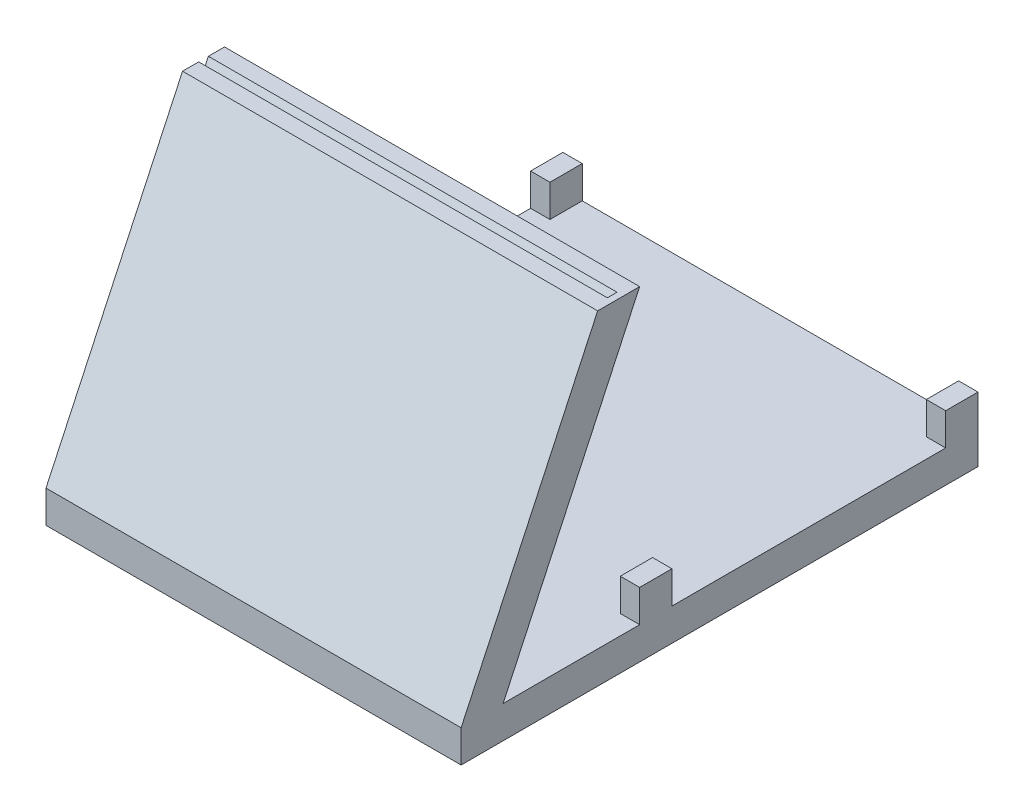
ISO-10303-21;
HEADER;
FILE_DESCRIPTION(('STEP AP214'),'2;1');
FILE_NAME('part.step','',(''),(''),'','','');
FILE_SCHEMA(('AUTOMOTIVE_DESIGN { 1 0 10303 214 1 1 1 1 }'));
ENDSEC;
DATA;
#1=APPLICATION_CONTEXT('core data for automotive mechanical design processes');
#2=APPLICATION_PROTOCOL_DEFINITION('international standard','automotive_design',2000,#1);
#3=PRODUCT_CONTEXT('',#1,'mechanical');
#4=PRODUCT('Part','Part','',(#3));
#5=PRODUCT_RELATED_PRODUCT_CATEGORY('part','',(#4));
#6=PRODUCT_DEFINITION_FORMATION('','',#4);
#7=PRODUCT_DEFINITION_CONTEXT('part definition',#1,'design');
#8=PRODUCT_DEFINITION('design','',#6,#7);
#9=PRODUCT_DEFINITION_SHAPE('','',#8);
#10=(LENGTH_UNIT() NAMED_UNIT(*) SI_UNIT(.MILLI.,.METRE.));
#11=(NAMED_UNIT(*) PLANE_ANGLE_UNIT() SI_UNIT($,.RADIAN.));
#12=(NAMED_UNIT(*) SI_UNIT($,.STERADIAN.) SOLID_ANGLE_UNIT());
#13=UNCERTAINTY_MEASURE_WITH_UNIT(LENGTH_MEASURE(1.E-05),#10,'distance_accuracy_value','');
#14=(GEOMETRIC_REPRESENTATION_CONTEXT(3) GLOBAL_UNCERTAINTY_ASSIGNED_CONTEXT((#13)) GLOBAL_UNIT_ASSIGNED_CONTEXT((#10,
#11,#12)) REPRESENTATION_CONTEXT('',''));
#15=CARTESIAN_POINT('',(0.,0.,0.));
#16=DIRECTION('',(0.,0.,1.));
#17=DIRECTION('',(1.,0.,0.));
#18=AXIS2_PLACEMENT_3D('',#15,#16,#17);
#19=CARTESIAN_POINT('',(0.,10.,0.));
#20=DIRECTION('',(0.,-1.,0.));
#21=DIRECTION('',(0.,0.,-1.));
#22=AXIS2_PLACEMENT_3D('',#19,#20,#21);
#23=PLANE('',#22);
#24=DIRECTION('',(-1.,0.,0.));
#25=VECTOR('',#24,1.);
#26=CARTESIAN_POINT('',(64.25,10.,14.7381738259296));
#27=LINE('',#26,#25);
#28=CARTESIAN_POINT('',(64.25,10.,14.7381738259296));
#29=VERTEX_POINT('',#28);
#30=CARTESIAN_POINT('',(58.25,10.,14.7381738259296));
#31=VERTEX_POINT('',#30);
#32=EDGE_CURVE('E511',#29,#31,#27,.T.);
#33=ORIENTED_EDGE('',*,*,#32,.F.);
#34=DIRECTION('',(0.,0.,-1.));
#35=VECTOR('',#34,1.);
#36=CARTESIAN_POINT('',(64.25,10.,80.));
#37=LINE('',#36,#35);
#38=CARTESIAN_POINT('',(64.25,10.,-70.));
#39=VERTEX_POINT('',#38);
#40=EDGE_CURVE('E230',#29,#39,#37,.T.);
#41=ORIENTED_EDGE('',*,*,#40,.T.);
#42=DIRECTION('',(1.,0.,0.));
#43=VECTOR('',#42,1.);
#44=CARTESIAN_POINT('',(64.25,10.,-70.));
#45=LINE('',#44,#43);
#46=CARTESIAN_POINT('',(58.25,10.,-70.));
#47=VERTEX_POINT('',#46);
#48=EDGE_CURVE('E237',#47,#39,#45,.T.);
#49=ORIENTED_EDGE('',*,*,#48,.F.);
#50=DIRECTION('',(0.,0.,1.));
#51=VECTOR('',#50,1.);
#52=CARTESIAN_POINT('',(58.25,10.,-80.));
#53=LINE('',#52,#51);
#54=CARTESIAN_POINT('',(58.25,10.,-80.));
#55=VERTEX_POINT('',#54);
#56=EDGE_CURVE('E232',#55,#47,#53,.T.);
#57=ORIENTED_EDGE('',*,*,#56,.F.);
#58=DIRECTION('',(-1.,0.,0.));
#59=VECTOR('',#58,1.);
#60=CARTESIAN_POINT('',(-64.25,10.,-80.));
#61=LINE('',#60,#59);
#62=CARTESIAN_POINT('',(-58.25,10.,-80.));
#63=VERTEX_POINT('',#62);
#64=EDGE_CURVE('E421',#55,#63,#61,.T.);
#65=ORIENTED_EDGE('',*,*,#64,.T.);
#66=DIRECTION('',(0.,0.,-1.));
#67=VECTOR('',#66,1.);
#68=CARTESIAN_POINT('',(-58.25,10.,-80.));
#69=LINE('',#68,#67);
#70=CARTESIAN_POINT('',(-58.25,10.,-70.));
#71=VERTEX_POINT('',#70);
#72=EDGE_CURVE('E317',#71,#63,#69,.T.);
#73=ORIENTED_EDGE('',*,*,#72,.F.);
#74=DIRECTION('',(1.,0.,0.));
#75=VECTOR('',#74,1.);
#76=CARTESIAN_POINT('',(-64.25,10.,-70.));
#77=LINE('',#76,#75);
#78=CARTESIAN_POINT('',(-64.25,10.,-70.));
#79=VERTEX_POINT('',#78);
#80=EDGE_CURVE('E311',#79,#71,#77,.T.);
#81=ORIENTED_EDGE('',*,*,#80,.F.);
#82=DIRECTION('',(0.,0.,1.));
#83=VECTOR('',#82,1.);
#84=CARTESIAN_POINT('',(-64.25,10.,80.));
#85=LINE('',#84,#83);
#86=CARTESIAN_POINT('',(-64.25,10.,14.7381738259296));
#87=VERTEX_POINT('',#86);
#88=EDGE_CURVE('E425',#79,#87,#85,.T.);
#89=ORIENTED_EDGE('',*,*,#88,.T.);
#90=DIRECTION('',(-1.,0.,0.));
#91=VECTOR('',#90,1.);
#92=CARTESIAN_POINT('',(-64.25,10.,14.7381738259296));
#93=LINE('',#92,#91);
#94=CARTESIAN_POINT('',(-58.25,10.,14.7381738259296));
#95=VERTEX_POINT('',#94);
#96=EDGE_CURVE('E276',#95,#87,#93,.T.);
#97=ORIENTED_EDGE('',*,*,#96,.F.);
#98=DIRECTION('',(0.,0.,-1.));
#99=VECTOR('',#98,1.);
#100=CARTESIAN_POINT('',(-58.25,10.,24.7381738259296));
#101=LINE('',#100,#99);
#102=CARTESIAN_POINT('',(-58.25,10.,24.7381738259296));
#103=VERTEX_POINT('',#102);
#104=EDGE_CURVE('E289',#103,#95,#101,.T.);
#105=ORIENTED_EDGE('',*,*,#104,.F.);
#106=DIRECTION('',(1.,0.,0.));
#107=VECTOR('',#106,1.);
#108=CARTESIAN_POINT('',(-64.25,10.,24.7381738259296));
#109=LINE('',#108,#107);
#110=CARTESIAN_POINT('',(-64.25,10.,24.7381738259296));
#111=VERTEX_POINT('',#110);
#112=EDGE_CURVE('E270',#111,#103,#109,.T.);
#113=ORIENTED_EDGE('',*,*,#112,.F.);
#114=CARTESIAN_POINT('',(-64.25,10.,67.));
#115=VERTEX_POINT('',#114);
#116=EDGE_CURVE('E429',#111,#115,#85,.T.);
#117=ORIENTED_EDGE('',*,*,#116,.T.);
#118=DIRECTION('',(-1.,0.,0.));
#119=VECTOR('',#118,1.);
#120=CARTESIAN_POINT('',(64.25,10.,66.9999999999999));
#121=LINE('',#120,#119);
#122=CARTESIAN_POINT('',(64.25,10.,67.));
#123=VERTEX_POINT('',#122);
#124=EDGE_CURVE('E345',#123,#115,#121,.T.);
#125=ORIENTED_EDGE('',*,*,#124,.F.);
#126=CARTESIAN_POINT('',(64.25,10.,24.7381738259296));
#127=VERTEX_POINT('',#126);
#128=EDGE_CURVE('E418',#123,#127,#37,.T.);
#129=ORIENTED_EDGE('',*,*,#128,.T.);
#130=DIRECTION('',(1.,0.,0.));
#131=VECTOR('',#130,1.);
#132=CARTESIAN_POINT('',(64.25,10.,24.7381738259296));
#133=LINE('',#132,#131);
#134=CARTESIAN_POINT('',(58.25,10.,24.7381738259296));
#135=VERTEX_POINT('',#134);
#136=EDGE_CURVE('E60',#135,#127,#133,.T.);
#137=ORIENTED_EDGE('',*,*,#136,.F.);
#138=DIRECTION('',(0.,0.,1.));
#139=VECTOR('',#138,1.);
#140=CARTESIAN_POINT('',(58.25,10.,24.7381738259296));
#141=LINE('',#140,#139);
#142=EDGE_CURVE('E55',#31,#135,#141,.T.);
#143=ORIENTED_EDGE('',*,*,#142,.F.);
#144=EDGE_LOOP('',(#33,#41,#49,#57,#65,#73,#81,#89,#97,#105,#113,#117,#125,#129,#137,#143));
#145=FACE_BOUND('',#144,.T.);
#146=ADVANCED_FACE('F39',(#145),#23,.F.);
#147=DIRECTION('',(-1.,0.,0.));
#148=VECTOR('',#147,1.);
#149=CARTESIAN_POINT('',(62.25,10.,75.));
#150=LINE('',#149,#148);
#151=CARTESIAN_POINT('',(62.25,10.,75.));
#152=VERTEX_POINT('',#151);
#153=CARTESIAN_POINT('',(-64.25,10.,75.));
#154=VERTEX_POINT('',#153);
#155=EDGE_CURVE('E358',#152,#154,#150,.T.);
#156=ORIENTED_EDGE('',*,*,#155,.F.);
#157=DIRECTION('',(0.,0.,1.));
#158=VECTOR('',#157,1.);
#159=CARTESIAN_POINT('',(62.25,10.,72.));
#160=LINE('',#159,#158);
#161=CARTESIAN_POINT('',(62.25,10.,72.));
#162=VERTEX_POINT('',#161);
#163=EDGE_CURVE('E394',#162,#152,#160,.T.);
#164=ORIENTED_EDGE('',*,*,#163,.F.);
#165=DIRECTION('',(1.,0.,0.));
#166=VECTOR('',#165,1.);
#167=CARTESIAN_POINT('',(-64.25,10.,72.));
#168=LINE('',#167,#166);
#169=CARTESIAN_POINT('',(-64.25,10.,72.));
#170=VERTEX_POINT('',#169);
#171=EDGE_CURVE('E376',#170,#162,#168,.T.);
#172=ORIENTED_EDGE('',*,*,#171,.F.);
#173=EDGE_CURVE('E424',#170,#154,#85,.T.);
#174=ORIENTED_EDGE('',*,*,#173,.T.);
#175=EDGE_LOOP('',(#156,#164,#172,#174));
#176=FACE_BOUND('',#175,.T.);
#177=ADVANCED_FACE('F482',(#176),#23,.F.);
#178=CARTESIAN_POINT('',(64.25,10.,80.));
#179=DIRECTION('',(-1.,0.,0.));
#180=DIRECTION('',(0.,0.,1.));
#181=AXIS2_PLACEMENT_3D('',#178,#179,#180);
#182=PLANE('',#181);
#183=DIRECTION('',(0.,0.,-1.));
#184=VECTOR('',#183,1.);
#185=CARTESIAN_POINT('',(64.25,0.,80.));
#186=LINE('',#185,#184);
#187=CARTESIAN_POINT('',(64.25,0.,80.));
#188=VERTEX_POINT('',#187);
#189=CARTESIAN_POINT('',(64.25,0.,-80.));
#190=VERTEX_POINT('',#189);
#191=EDGE_CURVE('E417',#188,#190,#186,.T.);
#192=ORIENTED_EDGE('',*,*,#191,.T.);
#193=DIRECTION('',(0.,-1.,0.));
#194=VECTOR('',#193,1.);
#195=CARTESIAN_POINT('',(64.25,10.,-80.));
#196=LINE('',#195,#194);
#197=CARTESIAN_POINT('',(64.25,20.,-80.));
#198=VERTEX_POINT('',#197);
#199=EDGE_CURVE('E11',#198,#190,#196,.T.);
#200=ORIENTED_EDGE('',*,*,#199,.F.);
#201=DIRECTION('',(0.,0.,-1.));
#202=VECTOR('',#201,1.);
#203=CARTESIAN_POINT('',(64.25,20.,-80.));
#204=LINE('',#203,#202);
#205=CARTESIAN_POINT('',(64.25,20.,-70.));
#206=VERTEX_POINT('',#205);
#207=EDGE_CURVE('E243',#206,#198,#204,.T.);
#208=ORIENTED_EDGE('',*,*,#207,.F.);
#209=DIRECTION('',(0.,-1.,0.));
#210=VECTOR('',#209,1.);
#211=CARTESIAN_POINT('',(64.25,20.,-70.));
#212=LINE('',#211,#210);
#213=EDGE_CURVE('E255',#206,#39,#212,.T.);
#214=ORIENTED_EDGE('',*,*,#213,.T.);
#215=ORIENTED_EDGE('',*,*,#40,.F.);
#216=DIRECTION('',(0.,-1.,0.));
#217=VECTOR('',#216,1.);
#218=CARTESIAN_POINT('',(64.25,20.,14.7381738259296));
#219=LINE('',#218,#217);
#220=CARTESIAN_POINT('',(64.25,20.,14.7381738259296));
#221=VERTEX_POINT('',#220);
#222=EDGE_CURVE('E210',#221,#29,#219,.T.);
#223=ORIENTED_EDGE('',*,*,#222,.F.);
#224=DIRECTION('',(0.,0.,-1.));
#225=VECTOR('',#224,1.);
#226=CARTESIAN_POINT('',(64.25,20.,24.7381738259296));
#227=LINE('',#226,#225);
#228=CARTESIAN_POINT('',(64.25,20.,24.7381738259296));
#229=VERTEX_POINT('',#228);
#230=EDGE_CURVE('E217',#229,#221,#227,.T.);
#231=ORIENTED_EDGE('',*,*,#230,.F.);
#232=DIRECTION('',(0.,-1.,0.));
#233=VECTOR('',#232,1.);
#234=CARTESIAN_POINT('',(64.25,20.,24.7381738259296));
#235=LINE('',#234,#233);
#236=EDGE_CURVE('E503',#229,#127,#235,.T.);
#237=ORIENTED_EDGE('',*,*,#236,.T.);
#238=ORIENTED_EDGE('',*,*,#128,.F.);
#239=DIRECTION('',(0.,0.906307787036648,-0.422618261740704));
#240=VECTOR('',#239,1.);
#241=CARTESIAN_POINT('',(64.25,10.,66.9999999999999));
#242=LINE('',#241,#240);
#243=CARTESIAN_POINT('',(64.25,100.630778703665,24.7381738259296));
#244=VERTEX_POINT('',#243);
#245=EDGE_CURVE('E368',#123,#244,#242,.T.);
#246=ORIENTED_EDGE('',*,*,#245,.T.);
#247=DIRECTION('',(0.,0.,-1.));
#248=VECTOR('',#247,1.);
#249=CARTESIAN_POINT('',(64.25,100.630778703665,37.7381738259296));
#250=LINE('',#249,#248);
#251=CARTESIAN_POINT('',(64.25,100.630778703665,37.7381738259296));
#252=VERTEX_POINT('',#251);
#253=EDGE_CURVE('E365',#252,#244,#250,.T.);
#254=ORIENTED_EDGE('',*,*,#253,.F.);
#255=DIRECTION('',(0.,0.906307787036648,-0.422618261740704));
#256=VECTOR('',#255,1.);
#257=CARTESIAN_POINT('',(64.25,10.,80.));
#258=LINE('',#257,#256);
#259=CARTESIAN_POINT('',(64.25,10.,80.));
#260=VERTEX_POINT('',#259);
#261=EDGE_CURVE('E361',#260,#252,#258,.T.);
#262=ORIENTED_EDGE('',*,*,#261,.F.);
#263=DIRECTION('',(0.,-1.,0.));
#264=VECTOR('',#263,1.);
#265=CARTESIAN_POINT('',(64.25,10.,80.));
#266=LINE('',#265,#264);
#267=EDGE_CURVE('E433',#260,#188,#266,.T.);
#268=ORIENTED_EDGE('',*,*,#267,.T.);
#269=EDGE_LOOP('',(#192,#200,#208,#214,#215,#223,#231,#237,#238,#246,#254,#262,#268));
#270=FACE_BOUND('',#269,.T.);
#271=ADVANCED_FACE('F41',(#270),#182,.F.);
#272=CARTESIAN_POINT('',(-64.25,10.,-80.));
#273=DIRECTION('',(0.,0.,1.));
#274=DIRECTION('',(1.,0.,0.));
#275=AXIS2_PLACEMENT_3D('',#272,#273,#274);
#276=PLANE('',#275);
#277=DIRECTION('',(-1.,0.,0.));
#278=VECTOR('',#277,1.);
#279=CARTESIAN_POINT('',(-64.25,0.,-80.));
#280=LINE('',#279,#278);
#281=CARTESIAN_POINT('',(-64.25,0.,-80.));
#282=VERTEX_POINT('',#281);
#283=EDGE_CURVE('E436',#190,#282,#280,.T.);
#284=ORIENTED_EDGE('',*,*,#283,.T.);
#285=DIRECTION('',(0.,-1.,0.));
#286=VECTOR('',#285,1.);
#287=CARTESIAN_POINT('',(-64.25,10.,-80.));
#288=LINE('',#287,#286);
#289=CARTESIAN_POINT('',(-64.25,20.,-80.));
#290=VERTEX_POINT('',#289);
#291=EDGE_CURVE('E48',#290,#282,#288,.T.);
#292=ORIENTED_EDGE('',*,*,#291,.F.);
#293=DIRECTION('',(-1.,0.,0.));
#294=VECTOR('',#293,1.);
#295=CARTESIAN_POINT('',(-64.25,20.,-80.));
#296=LINE('',#295,#294);
#297=CARTESIAN_POINT('',(-58.25,20.,-80.));
#298=VERTEX_POINT('',#297);
#299=EDGE_CURVE('E323',#298,#290,#296,.T.);
#300=ORIENTED_EDGE('',*,*,#299,.F.);
#301=DIRECTION('',(0.,-1.,0.));
#302=VECTOR('',#301,1.);
#303=CARTESIAN_POINT('',(-58.25,20.,-80.));
#304=LINE('',#303,#302);
#305=EDGE_CURVE('E327',#298,#63,#304,.T.);
#306=ORIENTED_EDGE('',*,*,#305,.T.);
#307=ORIENTED_EDGE('',*,*,#64,.F.);
#308=DIRECTION('',(0.,-1.,0.));
#309=VECTOR('',#308,1.);
#310=CARTESIAN_POINT('',(58.25,20.,-80.));
#311=LINE('',#310,#309);
#312=CARTESIAN_POINT('',(58.25,20.,-80.));
#313=VERTEX_POINT('',#312);
#314=EDGE_CURVE('E266',#313,#55,#311,.T.);
#315=ORIENTED_EDGE('',*,*,#314,.F.);
#316=DIRECTION('',(-1.,0.,0.));
#317=VECTOR('',#316,1.);
#318=CARTESIAN_POINT('',(64.25,20.,-80.));
#319=LINE('',#318,#317);
#320=EDGE_CURVE('E247',#198,#313,#319,.T.);
#321=ORIENTED_EDGE('',*,*,#320,.F.);
#322=ORIENTED_EDGE('',*,*,#199,.T.);
#323=EDGE_LOOP('',(#284,#292,#300,#306,#307,#315,#321,#322));
#324=FACE_BOUND('',#323,.T.);
#325=ADVANCED_FACE('F546',(#324),#276,.F.);
#326=CARTESIAN_POINT('',(-64.25,10.,80.));
#327=DIRECTION('',(1.,0.,0.));
#328=DIRECTION('',(0.,0.,-1.));
#329=AXIS2_PLACEMENT_3D('',#326,#327,#328);
#330=PLANE('',#329);
#331=DIRECTION('',(0.,0.,1.));
#332=VECTOR('',#331,1.);
#333=CARTESIAN_POINT('',(-64.25,0.,80.));
#334=LINE('',#333,#332);
#335=CARTESIAN_POINT('',(-64.25,0.,80.));
#336=VERTEX_POINT('',#335);
#337=EDGE_CURVE('E439',#282,#336,#334,.T.);
#338=ORIENTED_EDGE('',*,*,#337,.T.);
#339=DIRECTION('',(0.,-1.,0.));
#340=VECTOR('',#339,1.);
#341=CARTESIAN_POINT('',(-64.25,10.,80.));
#342=LINE('',#341,#340);
#343=CARTESIAN_POINT('',(-64.25,10.,80.));
#344=VERTEX_POINT('',#343);
#345=EDGE_CURVE('E448',#344,#336,#342,.T.);
#346=ORIENTED_EDGE('',*,*,#345,.F.);
#347=DIRECTION('',(0.,0.906307787036648,-0.422618261740704));
#348=VECTOR('',#347,1.);
#349=CARTESIAN_POINT('',(-64.25,10.,80.));
#350=LINE('',#349,#348);
#351=CARTESIAN_POINT('',(-64.25,100.630778703665,37.7381738259296));
#352=VERTEX_POINT('',#351);
#353=EDGE_CURVE('E349',#344,#352,#350,.T.);
#354=ORIENTED_EDGE('',*,*,#353,.T.);
#355=DIRECTION('',(0.,0.,1.));
#356=VECTOR('',#355,1.);
#357=CARTESIAN_POINT('',(-64.25,100.630778703665,32.7381738259296));
#358=LINE('',#357,#356);
#359=CARTESIAN_POINT('',(-64.25,100.630778703665,32.7381738259296));
#360=VERTEX_POINT('',#359);
#361=EDGE_CURVE('E346',#360,#352,#358,.T.);
#362=ORIENTED_EDGE('',*,*,#361,.F.);
#363=DIRECTION('',(0.,0.906307787036648,-0.422618261740704));
#364=VECTOR('',#363,1.);
#365=CARTESIAN_POINT('',(-64.25,10.,75.));
#366=LINE('',#365,#364);
#367=EDGE_CURVE('E350',#154,#360,#366,.T.);
#368=ORIENTED_EDGE('',*,*,#367,.F.);
#369=ORIENTED_EDGE('',*,*,#173,.F.);
#370=DIRECTION('',(0.,0.906307787036648,-0.422618261740704));
#371=VECTOR('',#370,1.);
#372=CARTESIAN_POINT('',(-64.25,10.,72.));
#373=LINE('',#372,#371);
#374=CARTESIAN_POINT('',(-64.25,100.630778703665,29.7381738259296));
#375=VERTEX_POINT('',#374);
#376=EDGE_CURVE('E386',#170,#375,#373,.T.);
#377=ORIENTED_EDGE('',*,*,#376,.T.);
#378=DIRECTION('',(0.,0.,1.));
#379=VECTOR('',#378,1.);
#380=CARTESIAN_POINT('',(-64.25,100.630778703665,24.7381738259296));
#381=LINE('',#380,#379);
#382=CARTESIAN_POINT('',(-64.25,100.630778703665,24.7381738259296));
#383=VERTEX_POINT('',#382);
#384=EDGE_CURVE('E383',#383,#375,#381,.T.);
#385=ORIENTED_EDGE('',*,*,#384,.F.);
#386=DIRECTION('',(0.,0.906307787036648,-0.422618261740704));
#387=VECTOR('',#386,1.);
#388=CARTESIAN_POINT('',(-64.25,10.,67.));
#389=LINE('',#388,#387);
#390=EDGE_CURVE('E379',#115,#383,#389,.T.);
#391=ORIENTED_EDGE('',*,*,#390,.F.);
#392=ORIENTED_EDGE('',*,*,#116,.F.);
#393=DIRECTION('',(0.,-1.,0.));
#394=VECTOR('',#393,1.);
#395=CARTESIAN_POINT('',(-64.25,20.,24.7381738259296));
#396=LINE('',#395,#394);
#397=CARTESIAN_POINT('',(-64.25,20.,24.7381738259296));
#398=VERTEX_POINT('',#397);
#399=EDGE_CURVE('E307',#398,#111,#396,.T.);
#400=ORIENTED_EDGE('',*,*,#399,.F.);
#401=DIRECTION('',(0.,0.,1.));
#402=VECTOR('',#401,1.);
#403=CARTESIAN_POINT('',(-64.25,20.,24.7381738259296));
#404=LINE('',#403,#402);
#405=CARTESIAN_POINT('',(-64.25,20.,14.7381738259296));
#406=VERTEX_POINT('',#405);
#407=EDGE_CURVE('E271',#406,#398,#404,.T.);
#408=ORIENTED_EDGE('',*,*,#407,.F.);
#409=DIRECTION('',(0.,-1.,0.));
#410=VECTOR('',#409,1.);
#411=CARTESIAN_POINT('',(-64.25,20.,14.7381738259296));
#412=LINE('',#411,#410);
#413=EDGE_CURVE('E285',#406,#87,#412,.T.);
#414=ORIENTED_EDGE('',*,*,#413,.T.);
#415=ORIENTED_EDGE('',*,*,#88,.F.);
#416=DIRECTION('',(0.,-1.,0.));
#417=VECTOR('',#416,1.);
#418=CARTESIAN_POINT('',(-64.25,20.,-70.));
#419=LINE('',#418,#417);
#420=CARTESIAN_POINT('',(-64.25,20.,-70.));
#421=VERTEX_POINT('',#420);
#422=EDGE_CURVE('E341',#421,#79,#419,.T.);
#423=ORIENTED_EDGE('',*,*,#422,.F.);
#424=DIRECTION('',(0.,0.,1.));
#425=VECTOR('',#424,1.);
#426=CARTESIAN_POINT('',(-64.25,20.,-80.));
#427=LINE('',#426,#425);
#428=EDGE_CURVE('E312',#290,#421,#427,.T.);
#429=ORIENTED_EDGE('',*,*,#428,.F.);
#430=ORIENTED_EDGE('',*,*,#291,.T.);
#431=EDGE_LOOP('',(#338,#346,#354,#362,#368,#369,#377,#385,#391,#392,#400,#408,#414,#415,#423,
#429,#430));
#432=FACE_BOUND('',#431,.T.);
#433=ADVANCED_FACE('F456',(#432),#330,.F.);
#434=CARTESIAN_POINT('',(-64.25,10.,80.));
#435=DIRECTION('',(0.,0.,-1.));
#436=DIRECTION('',(-1.,0.,0.));
#437=AXIS2_PLACEMENT_3D('',#434,#435,#436);
#438=PLANE('',#437);
#439=DIRECTION('',(1.,0.,0.));
#440=VECTOR('',#439,1.);
#441=CARTESIAN_POINT('',(-64.25,0.,80.));
#442=LINE('',#441,#440);
#443=EDGE_CURVE('E442',#336,#188,#442,.T.);
#444=ORIENTED_EDGE('',*,*,#443,.T.);
#445=ORIENTED_EDGE('',*,*,#267,.F.);
#446=DIRECTION('',(1.,0.,0.));
#447=VECTOR('',#446,1.);
#448=CARTESIAN_POINT('',(-64.25,10.,80.));
#449=LINE('',#448,#447);
#450=EDGE_CURVE('E428',#344,#260,#449,.T.);
#451=ORIENTED_EDGE('',*,*,#450,.F.);
#452=ORIENTED_EDGE('',*,*,#345,.T.);
#453=EDGE_LOOP('',(#444,#445,#451,#452));
#454=FACE_BOUND('',#453,.T.);
#455=ADVANCED_FACE('F465',(#454),#438,.F.);
#456=CARTESIAN_POINT('',(0.,0.,0.));
#457=DIRECTION('',(0.,-1.,0.));
#458=DIRECTION('',(0.,0.,-1.));
#459=AXIS2_PLACEMENT_3D('',#456,#457,#458);
#460=PLANE('',#459);
#461=ORIENTED_EDGE('',*,*,#191,.F.);
#462=ORIENTED_EDGE('',*,*,#443,.F.);
#463=ORIENTED_EDGE('',*,*,#337,.F.);
#464=ORIENTED_EDGE('',*,*,#283,.F.);
#465=EDGE_LOOP('',(#461,#462,#463,#464));
#466=FACE_BOUND('',#465,.T.);
#467=ADVANCED_FACE('F463',(#466),#460,.T.);
#468=CARTESIAN_POINT('',(0.,100.630778703665,-42.2618261740704));
#469=DIRECTION('',(0.,1.,0.));
#470=DIRECTION('',(0.,0.,1.));
#471=AXIS2_PLACEMENT_3D('',#468,#469,#470);
#472=PLANE('',#471);
#473=ORIENTED_EDGE('',*,*,#361,.T.);
#474=DIRECTION('',(1.,0.,0.));
#475=VECTOR('',#474,1.);
#476=CARTESIAN_POINT('',(-64.25,100.630778703665,37.7381738259296));
#477=LINE('',#476,#475);
#478=EDGE_CURVE('E354',#352,#252,#477,.T.);
#479=ORIENTED_EDGE('',*,*,#478,.T.);
#480=ORIENTED_EDGE('',*,*,#253,.T.);
#481=DIRECTION('',(-1.,0.,0.));
#482=VECTOR('',#481,1.);
#483=CARTESIAN_POINT('',(64.25,100.630778703665,24.7381738259296));
#484=LINE('',#483,#482);
#485=EDGE_CURVE('E372',#244,#383,#484,.T.);
#486=ORIENTED_EDGE('',*,*,#485,.T.);
#487=ORIENTED_EDGE('',*,*,#384,.T.);
#488=DIRECTION('',(1.,0.,0.));
#489=VECTOR('',#488,1.);
#490=CARTESIAN_POINT('',(-64.25,100.630778703665,29.7381738259296));
#491=LINE('',#490,#489);
#492=CARTESIAN_POINT('',(62.25,100.630778703665,29.7381738259296));
#493=VERTEX_POINT('',#492);
#494=EDGE_CURVE('E390',#375,#493,#491,.T.);
#495=ORIENTED_EDGE('',*,*,#494,.T.);
#496=DIRECTION('',(0.,0.,1.));
#497=VECTOR('',#496,1.);
#498=CARTESIAN_POINT('',(62.25,100.630778703665,29.7381738259296));
#499=LINE('',#498,#497);
#500=CARTESIAN_POINT('',(62.25,100.630778703665,32.7381738259296));
#501=VERTEX_POINT('',#500);
#502=EDGE_CURVE('E401',#493,#501,#499,.T.);
#503=ORIENTED_EDGE('',*,*,#502,.T.);
#504=DIRECTION('',(-1.,0.,0.));
#505=VECTOR('',#504,1.);
#506=CARTESIAN_POINT('',(62.25,100.630778703665,32.7381738259296));
#507=LINE('',#506,#505);
#508=EDGE_CURVE('E411',#501,#360,#507,.T.);
#509=ORIENTED_EDGE('',*,*,#508,.T.);
#510=EDGE_LOOP('',(#473,#479,#480,#486,#487,#495,#503,#509));
#511=FACE_BOUND('',#510,.T.);
#512=ADVANCED_FACE('F502',(#511),#472,.T.);
#513=CARTESIAN_POINT('',(-64.25,10.,80.));
#514=DIRECTION('',(0.,0.422618261740704,0.906307787036648));
#515=DIRECTION('',(0.,-0.906307787036648,0.422618261740704));
#516=AXIS2_PLACEMENT_3D('',#513,#514,#515);
#517=PLANE('',#516);
#518=ORIENTED_EDGE('',*,*,#261,.T.);
#519=ORIENTED_EDGE('',*,*,#478,.F.);
#520=ORIENTED_EDGE('',*,*,#353,.F.);
#521=ORIENTED_EDGE('',*,*,#450,.T.);
#522=EDGE_LOOP('',(#518,#519,#520,#521));
#523=FACE_BOUND('',#522,.T.);
#524=ADVANCED_FACE('F471',(#523),#517,.T.);
#525=CARTESIAN_POINT('',(64.25,10.,66.9999999999999));
#526=DIRECTION('',(0.,-0.422618261740704,-0.906307787036648));
#527=DIRECTION('',(0.,0.906307787036648,-0.422618261740704));
#528=AXIS2_PLACEMENT_3D('',#525,#526,#527);
#529=PLANE('',#528);
#530=ORIENTED_EDGE('',*,*,#390,.T.);
#531=ORIENTED_EDGE('',*,*,#485,.F.);
#532=ORIENTED_EDGE('',*,*,#245,.F.);
#533=ORIENTED_EDGE('',*,*,#124,.T.);
#534=EDGE_LOOP('',(#530,#531,#532,#533));
#535=FACE_BOUND('',#534,.T.);
#536=ADVANCED_FACE('F500',(#535),#529,.T.);
#537=CARTESIAN_POINT('',(-64.25,10.,72.));
#538=DIRECTION('',(0.,0.422618261740704,0.906307787036648));
#539=DIRECTION('',(0.,-0.906307787036648,0.422618261740704));
#540=AXIS2_PLACEMENT_3D('',#537,#538,#539);
#541=PLANE('',#540);
#542=DIRECTION('',(0.,0.906307787036648,-0.422618261740704));
#543=VECTOR('',#542,1.);
#544=CARTESIAN_POINT('',(62.25,10.,72.));
#545=LINE('',#544,#543);
#546=EDGE_CURVE('E397',#162,#493,#545,.T.);
#547=ORIENTED_EDGE('',*,*,#546,.T.);
#548=ORIENTED_EDGE('',*,*,#494,.F.);
#549=ORIENTED_EDGE('',*,*,#376,.F.);
#550=ORIENTED_EDGE('',*,*,#171,.T.);
#551=EDGE_LOOP('',(#547,#548,#549,#550));
#552=FACE_BOUND('',#551,.T.);
#553=ADVANCED_FACE('F489',(#552),#541,.T.);
#554=CARTESIAN_POINT('',(62.25,10.,72.));
#555=DIRECTION('',(-1.,0.,0.));
#556=DIRECTION('',(0.,0.,1.));
#557=AXIS2_PLACEMENT_3D('',#554,#555,#556);
#558=PLANE('',#557);
#559=DIRECTION('',(0.,0.906307787036648,-0.422618261740704));
#560=VECTOR('',#559,1.);
#561=CARTESIAN_POINT('',(62.25,10.,75.));
#562=LINE('',#561,#560);
#563=EDGE_CURVE('E407',#152,#501,#562,.T.);
#564=ORIENTED_EDGE('',*,*,#563,.T.);
#565=ORIENTED_EDGE('',*,*,#502,.F.);
#566=ORIENTED_EDGE('',*,*,#546,.F.);
#567=ORIENTED_EDGE('',*,*,#163,.T.);
#568=EDGE_LOOP('',(#564,#565,#566,#567));
#569=FACE_BOUND('',#568,.T.);
#570=ADVANCED_FACE('F485',(#569),#558,.T.);
#571=CARTESIAN_POINT('',(62.25,10.,75.));
#572=DIRECTION('',(0.,-0.422618261740704,-0.906307787036648));
#573=DIRECTION('',(0.,0.906307787036648,-0.422618261740704));
#574=AXIS2_PLACEMENT_3D('',#571,#572,#573);
#575=PLANE('',#574);
#576=ORIENTED_EDGE('',*,*,#508,.F.);
#577=ORIENTED_EDGE('',*,*,#563,.F.);
#578=ORIENTED_EDGE('',*,*,#155,.T.);
#579=ORIENTED_EDGE('',*,*,#367,.T.);
#580=EDGE_LOOP('',(#576,#577,#578,#579));
#581=FACE_BOUND('',#580,.T.);
#582=ADVANCED_FACE('F479',(#581),#575,.T.);
#583=CARTESIAN_POINT('',(-64.25,20.,-70.));
#584=DIRECTION('',(0.,0.,-1.));
#585=DIRECTION('',(-1.,0.,0.));
#586=AXIS2_PLACEMENT_3D('',#583,#584,#585);
#587=PLANE('',#586);
#588=ORIENTED_EDGE('',*,*,#80,.T.);
#589=DIRECTION('',(0.,-1.,0.));
#590=VECTOR('',#589,1.);
#591=CARTESIAN_POINT('',(-58.25,20.,-70.));
#592=LINE('',#591,#590);
#593=CARTESIAN_POINT('',(-58.25,20.,-70.));
#594=VERTEX_POINT('',#593);
#595=EDGE_CURVE('E337',#594,#71,#592,.T.);
#596=ORIENTED_EDGE('',*,*,#595,.F.);
#597=DIRECTION('',(1.,0.,0.));
#598=VECTOR('',#597,1.);
#599=CARTESIAN_POINT('',(-64.25,20.,-70.));
#600=LINE('',#599,#598);
#601=EDGE_CURVE('E316',#421,#594,#600,.T.);
#602=ORIENTED_EDGE('',*,*,#601,.F.);
#603=ORIENTED_EDGE('',*,*,#422,.T.);
#604=EDGE_LOOP('',(#588,#596,#602,#603));
#605=FACE_BOUND('',#604,.T.);
#606=ADVANCED_FACE('F571',(#605),#587,.F.);
#607=CARTESIAN_POINT('',(-58.25,20.,-80.));
#608=DIRECTION('',(-1.,0.,0.));
#609=DIRECTION('',(0.,0.,1.));
#610=AXIS2_PLACEMENT_3D('',#607,#608,#609);
#611=PLANE('',#610);
#612=ORIENTED_EDGE('',*,*,#72,.T.);
#613=ORIENTED_EDGE('',*,*,#305,.F.);
#614=DIRECTION('',(0.,0.,-1.));
#615=VECTOR('',#614,1.);
#616=CARTESIAN_POINT('',(-58.25,20.,-80.));
#617=LINE('',#616,#615);
#618=EDGE_CURVE('E320',#594,#298,#617,.T.);
#619=ORIENTED_EDGE('',*,*,#618,.F.);
#620=ORIENTED_EDGE('',*,*,#595,.T.);
#621=EDGE_LOOP('',(#612,#613,#619,#620));
#622=FACE_BOUND('',#621,.T.);
#623=ADVANCED_FACE('F567',(#622),#611,.F.);
#624=CARTESIAN_POINT('',(0.,20.,0.));
#625=DIRECTION('',(0.,1.,0.));
#626=DIRECTION('',(0.,0.,1.));
#627=AXIS2_PLACEMENT_3D('',#624,#625,#626);
#628=PLANE('',#627);
#629=ORIENTED_EDGE('',*,*,#428,.T.);
#630=ORIENTED_EDGE('',*,*,#601,.T.);
#631=ORIENTED_EDGE('',*,*,#618,.T.);
#632=ORIENTED_EDGE('',*,*,#299,.T.);
#633=EDGE_LOOP('',(#629,#630,#631,#632));
#634=FACE_BOUND('',#633,.T.);
#635=ADVANCED_FACE('F587',(#634),#628,.T.);
#636=CARTESIAN_POINT('',(-64.25,20.,24.7381738259296));
#637=DIRECTION('',(0.,0.,-1.));
#638=DIRECTION('',(-1.,0.,0.));
#639=AXIS2_PLACEMENT_3D('',#636,#637,#638);
#640=PLANE('',#639);
#641=ORIENTED_EDGE('',*,*,#112,.T.);
#642=DIRECTION('',(0.,-1.,0.));
#643=VECTOR('',#642,1.);
#644=CARTESIAN_POINT('',(-58.25,20.,24.7381738259296));
#645=LINE('',#644,#643);
#646=CARTESIAN_POINT('',(-58.25,20.,24.7381738259296));
#647=VERTEX_POINT('',#646);
#648=EDGE_CURVE('E303',#647,#103,#645,.T.);
#649=ORIENTED_EDGE('',*,*,#648,.F.);
#650=DIRECTION('',(1.,0.,0.));
#651=VECTOR('',#650,1.);
#652=CARTESIAN_POINT('',(-64.25,20.,24.7381738259296));
#653=LINE('',#652,#651);
#654=EDGE_CURVE('E275',#398,#647,#653,.T.);
#655=ORIENTED_EDGE('',*,*,#654,.F.);
#656=ORIENTED_EDGE('',*,*,#399,.T.);
#657=EDGE_LOOP('',(#641,#649,#655,#656));
#658=FACE_BOUND('',#657,.T.);
#659=ADVANCED_FACE('F585',(#658),#640,.F.);
#660=CARTESIAN_POINT('',(-58.25,20.,24.7381738259296));
#661=DIRECTION('',(-1.,0.,0.));
#662=DIRECTION('',(0.,0.,1.));
#663=AXIS2_PLACEMENT_3D('',#660,#661,#662);
#664=PLANE('',#663);
#665=ORIENTED_EDGE('',*,*,#104,.T.);
#666=DIRECTION('',(0.,-1.,0.));
#667=VECTOR('',#666,1.);
#668=CARTESIAN_POINT('',(-58.25,20.,14.7381738259296));
#669=LINE('',#668,#667);
#670=CARTESIAN_POINT('',(-58.25,20.,14.7381738259296));
#671=VERTEX_POINT('',#670);
#672=EDGE_CURVE('E299',#671,#95,#669,.T.);
#673=ORIENTED_EDGE('',*,*,#672,.F.);
#674=DIRECTION('',(0.,0.,-1.));
#675=VECTOR('',#674,1.);
#676=CARTESIAN_POINT('',(-58.25,20.,24.7381738259296));
#677=LINE('',#676,#675);
#678=EDGE_CURVE('E279',#647,#671,#677,.T.);
#679=ORIENTED_EDGE('',*,*,#678,.F.);
#680=ORIENTED_EDGE('',*,*,#648,.T.);
#681=EDGE_LOOP('',(#665,#673,#679,#680));
#682=FACE_BOUND('',#681,.T.);
#683=ADVANCED_FACE('F583',(#682),#664,.F.);
#684=CARTESIAN_POINT('',(-64.25,20.,14.7381738259296));
#685=DIRECTION('',(0.,0.,1.));
#686=DIRECTION('',(1.,0.,0.));
#687=AXIS2_PLACEMENT_3D('',#684,#685,#686);
#688=PLANE('',#687);
#689=ORIENTED_EDGE('',*,*,#96,.T.);
#690=ORIENTED_EDGE('',*,*,#413,.F.);
#691=DIRECTION('',(-1.,0.,0.));
#692=VECTOR('',#691,1.);
#693=CARTESIAN_POINT('',(-64.25,20.,14.7381738259296));
#694=LINE('',#693,#692);
#695=EDGE_CURVE('E282',#671,#406,#694,.T.);
#696=ORIENTED_EDGE('',*,*,#695,.F.);
#697=ORIENTED_EDGE('',*,*,#672,.T.);
#698=EDGE_LOOP('',(#689,#690,#696,#697));
#699=FACE_BOUND('',#698,.T.);
#700=ADVANCED_FACE('F574',(#699),#688,.F.);
#701=CARTESIAN_POINT('',(0.,20.,0.));
#702=DIRECTION('',(0.,-1.,0.));
#703=DIRECTION('',(0.,0.,-1.));
#704=AXIS2_PLACEMENT_3D('',#701,#702,#703);
#705=PLANE('',#704);
#706=ORIENTED_EDGE('',*,*,#407,.T.);
#707=ORIENTED_EDGE('',*,*,#654,.T.);
#708=ORIENTED_EDGE('',*,*,#678,.T.);
#709=ORIENTED_EDGE('',*,*,#695,.T.);
#710=EDGE_LOOP('',(#706,#707,#708,#709));
#711=FACE_BOUND('',#710,.T.);
#712=ADVANCED_FACE('F579',(#711),#705,.F.);
#713=CARTESIAN_POINT('',(58.25,20.,-80.));
#714=DIRECTION('',(1.,0.,0.));
#715=DIRECTION('',(0.,0.,-1.));
#716=AXIS2_PLACEMENT_3D('',#713,#714,#715);
#717=PLANE('',#716);
#718=ORIENTED_EDGE('',*,*,#56,.T.);
#719=DIRECTION('',(0.,-1.,0.));
#720=VECTOR('',#719,1.);
#721=CARTESIAN_POINT('',(58.25,20.,-70.));
#722=LINE('',#721,#720);
#723=CARTESIAN_POINT('',(58.25,20.,-70.));
#724=VERTEX_POINT('',#723);
#725=EDGE_CURVE('E262',#724,#47,#722,.T.);
#726=ORIENTED_EDGE('',*,*,#725,.F.);
#727=DIRECTION('',(0.,0.,1.));
#728=VECTOR('',#727,1.);
#729=CARTESIAN_POINT('',(58.25,20.,-80.));
#730=LINE('',#729,#728);
#731=EDGE_CURVE('E250',#313,#724,#730,.T.);
#732=ORIENTED_EDGE('',*,*,#731,.F.);
#733=ORIENTED_EDGE('',*,*,#314,.T.);
#734=EDGE_LOOP('',(#718,#726,#732,#733));
#735=FACE_BOUND('',#734,.T.);
#736=ADVANCED_FACE('F563',(#735),#717,.F.);
#737=CARTESIAN_POINT('',(64.25,20.,-70.));
#738=DIRECTION('',(0.,0.,-1.));
#739=DIRECTION('',(-1.,0.,0.));
#740=AXIS2_PLACEMENT_3D('',#737,#738,#739);
#741=PLANE('',#740);
#742=ORIENTED_EDGE('',*,*,#48,.T.);
#743=ORIENTED_EDGE('',*,*,#213,.F.);
#744=DIRECTION('',(1.,0.,0.));
#745=VECTOR('',#744,1.);
#746=CARTESIAN_POINT('',(64.25,20.,-70.));
#747=LINE('',#746,#745);
#748=EDGE_CURVE('E253',#724,#206,#747,.T.);
#749=ORIENTED_EDGE('',*,*,#748,.F.);
#750=ORIENTED_EDGE('',*,*,#725,.T.);
#751=EDGE_LOOP('',(#742,#743,#749,#750));
#752=FACE_BOUND('',#751,.T.);
#753=ADVANCED_FACE('F560',(#752),#741,.F.);
#754=CARTESIAN_POINT('',(0.,20.,0.));
#755=DIRECTION('',(0.,-1.,0.));
#756=DIRECTION('',(0.,0.,-1.));
#757=AXIS2_PLACEMENT_3D('',#754,#755,#756);
#758=PLANE('',#757);
#759=ORIENTED_EDGE('',*,*,#207,.T.);
#760=ORIENTED_EDGE('',*,*,#320,.T.);
#761=ORIENTED_EDGE('',*,*,#731,.T.);
#762=ORIENTED_EDGE('',*,*,#748,.T.);
#763=EDGE_LOOP('',(#759,#760,#761,#762));
#764=FACE_BOUND('',#763,.T.);
#765=ADVANCED_FACE('F531',(#764),#758,.F.);
#766=CARTESIAN_POINT('',(64.25,20.,14.7381738259296));
#767=DIRECTION('',(0.,0.,1.));
#768=DIRECTION('',(1.,0.,0.));
#769=AXIS2_PLACEMENT_3D('',#766,#767,#768);
#770=PLANE('',#769);
#771=ORIENTED_EDGE('',*,*,#32,.T.);
#772=DIRECTION('',(0.,-1.,0.));
#773=VECTOR('',#772,1.);
#774=CARTESIAN_POINT('',(58.25,20.,14.7381738259296));
#775=LINE('',#774,#773);
#776=CARTESIAN_POINT('',(58.25,20.,14.7381738259296));
#777=VERTEX_POINT('',#776);
#778=EDGE_CURVE('E212',#777,#31,#775,.T.);
#779=ORIENTED_EDGE('',*,*,#778,.F.);
#780=DIRECTION('',(-1.,0.,0.));
#781=VECTOR('',#780,1.);
#782=CARTESIAN_POINT('',(64.25,20.,14.7381738259296));
#783=LINE('',#782,#781);
#784=EDGE_CURVE('E206',#221,#777,#783,.T.);
#785=ORIENTED_EDGE('',*,*,#784,.F.);
#786=ORIENTED_EDGE('',*,*,#222,.T.);
#787=EDGE_LOOP('',(#771,#779,#785,#786));
#788=FACE_BOUND('',#787,.T.);
#789=ADVANCED_FACE('F208',(#788),#770,.F.);
#790=CARTESIAN_POINT('',(58.25,20.,24.7381738259296));
#791=DIRECTION('',(1.,0.,0.));
#792=DIRECTION('',(0.,0.,-1.));
#793=AXIS2_PLACEMENT_3D('',#790,#791,#792);
#794=PLANE('',#793);
#795=ORIENTED_EDGE('',*,*,#142,.T.);
#796=DIRECTION('',(0.,-1.,0.));
#797=VECTOR('',#796,1.);
#798=CARTESIAN_POINT('',(58.25,20.,24.7381738259296));
#799=LINE('',#798,#797);
#800=CARTESIAN_POINT('',(58.25,20.,24.7381738259296));
#801=VERTEX_POINT('',#800);
#802=EDGE_CURVE('E239',#801,#135,#799,.T.);
#803=ORIENTED_EDGE('',*,*,#802,.F.);
#804=DIRECTION('',(0.,0.,1.));
#805=VECTOR('',#804,1.);
#806=CARTESIAN_POINT('',(58.25,20.,24.7381738259296));
#807=LINE('',#806,#805);
#808=EDGE_CURVE('E216',#777,#801,#807,.T.);
#809=ORIENTED_EDGE('',*,*,#808,.F.);
#810=ORIENTED_EDGE('',*,*,#778,.T.);
#811=EDGE_LOOP('',(#795,#803,#809,#810));
#812=FACE_BOUND('',#811,.T.);
#813=ADVANCED_FACE('F523',(#812),#794,.F.);
#814=CARTESIAN_POINT('',(64.25,20.,24.7381738259296));
#815=DIRECTION('',(0.,0.,-1.));
#816=DIRECTION('',(-1.,0.,0.));
#817=AXIS2_PLACEMENT_3D('',#814,#815,#816);
#818=PLANE('',#817);
#819=ORIENTED_EDGE('',*,*,#136,.T.);
#820=ORIENTED_EDGE('',*,*,#236,.F.);
#821=DIRECTION('',(1.,0.,0.));
#822=VECTOR('',#821,1.);
#823=CARTESIAN_POINT('',(64.25,20.,24.7381738259296));
#824=LINE('',#823,#822);
#825=EDGE_CURVE('E222',#801,#229,#824,.T.);
#826=ORIENTED_EDGE('',*,*,#825,.F.);
#827=ORIENTED_EDGE('',*,*,#802,.T.);
#828=EDGE_LOOP('',(#819,#820,#826,#827));
#829=FACE_BOUND('',#828,.T.);
#830=ADVANCED_FACE('F506',(#829),#818,.F.);
#831=CARTESIAN_POINT('',(0.,20.,0.));
#832=DIRECTION('',(0.,1.,0.));
#833=DIRECTION('',(0.,0.,1.));
#834=AXIS2_PLACEMENT_3D('',#831,#832,#833);
#835=PLANE('',#834);
#836=ORIENTED_EDGE('',*,*,#230,.T.);
#837=ORIENTED_EDGE('',*,*,#784,.T.);
#838=ORIENTED_EDGE('',*,*,#808,.T.);
#839=ORIENTED_EDGE('',*,*,#825,.T.);
#840=EDGE_LOOP('',(#836,#837,#838,#839));
#841=FACE_BOUND('',#840,.T.);
#842=ADVANCED_FACE('F220',(#841),#835,.T.);
#843=CLOSED_SHELL('',(#146,#177,#271,#325,#433,#455,#467,#512,#524,#536,#553,#570,#582,#606,
#623,#635,#659,#683,#700,#712,#736,#753,#765,#789,#813,#830,#842));
#844=MANIFOLD_SOLID_BREP('B2',#843);
#845=ADVANCED_BREP_SHAPE_REPRESENTATION('',(#18,#844),#14);
#846=SHAPE_DEFINITION_REPRESENTATION(#9,#845);
ENDSEC;
END-ISO-10303-21;
